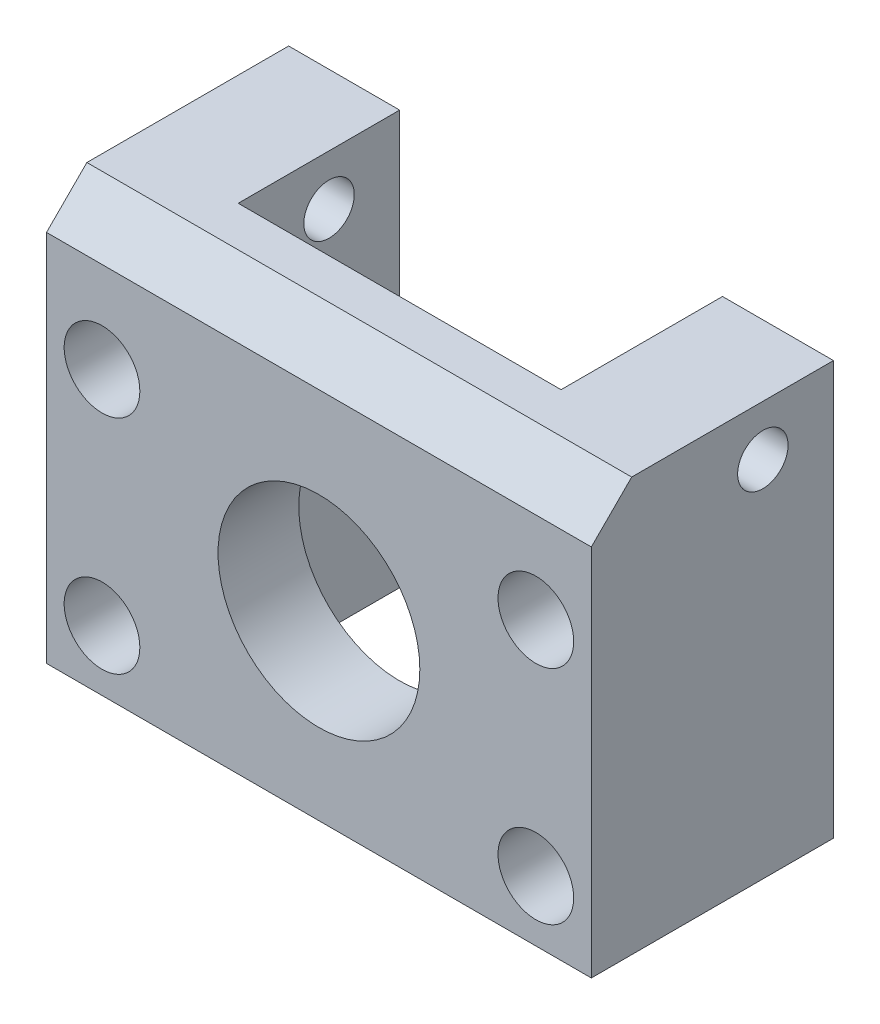
ISO-10303-21;
HEADER;
FILE_DESCRIPTION(('STEP AP214'),'2;1');
FILE_NAME('part.step','',(''),(''),'','','');
FILE_SCHEMA(('AUTOMOTIVE_DESIGN { 1 0 10303 214 1 1 1 1 }'));
ENDSEC;
DATA;
#1=APPLICATION_CONTEXT('core data for automotive mechanical design processes');
#2=APPLICATION_PROTOCOL_DEFINITION('international standard','automotive_design',2000,#1);
#3=PRODUCT_CONTEXT('',#1,'mechanical');
#4=PRODUCT('Part','Part','',(#3));
#5=PRODUCT_RELATED_PRODUCT_CATEGORY('part','',(#4));
#6=PRODUCT_DEFINITION_FORMATION('','',#4);
#7=PRODUCT_DEFINITION_CONTEXT('part definition',#1,'design');
#8=PRODUCT_DEFINITION('design','',#6,#7);
#9=PRODUCT_DEFINITION_SHAPE('','',#8);
#10=(LENGTH_UNIT() NAMED_UNIT(*) SI_UNIT(.MILLI.,.METRE.));
#11=(NAMED_UNIT(*) PLANE_ANGLE_UNIT() SI_UNIT($,.RADIAN.));
#12=(NAMED_UNIT(*) SI_UNIT($,.STERADIAN.) SOLID_ANGLE_UNIT());
#13=UNCERTAINTY_MEASURE_WITH_UNIT(LENGTH_MEASURE(1.E-05),#10,'distance_accuracy_value','');
#14=(GEOMETRIC_REPRESENTATION_CONTEXT(3) GLOBAL_UNCERTAINTY_ASSIGNED_CONTEXT((#13)) GLOBAL_UNIT_ASSIGNED_CONTEXT((#10,
#11,#12)) REPRESENTATION_CONTEXT('',''));
#15=CARTESIAN_POINT('',(0.,0.,0.));
#16=DIRECTION('',(0.,0.,1.));
#17=DIRECTION('',(1.,0.,0.));
#18=AXIS2_PLACEMENT_3D('',#15,#16,#17);
#19=CARTESIAN_POINT('',(0.,0.,-24.));
#20=DIRECTION('',(0.,0.,1.));
#21=DIRECTION('',(1.,0.,0.));
#22=AXIS2_PLACEMENT_3D('',#19,#20,#21);
#23=PLANE('',#22);
#24=CARTESIAN_POINT('',(-21.5,7.49999999999999,-24.));
#25=DIRECTION('',(0.,0.,1.));
#26=DIRECTION('',(1.,0.,0.));
#27=AXIS2_PLACEMENT_3D('',#24,#25,#26);
#28=CIRCLE('',#27,3.75);
#29=CARTESIAN_POINT('',(-17.75,7.49999999999999,-24.));
#30=VERTEX_POINT('',#29);
#31=EDGE_CURVE('E159',#30,#30,#28,.T.);
#32=ORIENTED_EDGE('',*,*,#31,.T.);
#33=EDGE_LOOP('',(#32));
#34=FACE_BOUND('',#33,.T.);
#35=CARTESIAN_POINT('',(-21.5,-14.5,-24.));
#36=DIRECTION('',(0.,0.,1.));
#37=DIRECTION('',(1.,0.,0.));
#38=AXIS2_PLACEMENT_3D('',#35,#36,#37);
#39=CIRCLE('',#38,3.75);
#40=CARTESIAN_POINT('',(-17.75,-14.5,-24.));
#41=VERTEX_POINT('',#40);
#42=EDGE_CURVE('E141',#41,#41,#39,.T.);
#43=ORIENTED_EDGE('',*,*,#42,.T.);
#44=EDGE_LOOP('',(#43));
#45=FACE_BOUND('',#44,.T.);
#46=DIRECTION('',(-1.,0.,0.));
#47=VECTOR('',#46,1.);
#48=CARTESIAN_POINT('',(-27.,20.5,-24.));
#49=LINE('',#48,#47);
#50=CARTESIAN_POINT('',(-16.,20.5,-24.));
#51=VERTEX_POINT('',#50);
#52=CARTESIAN_POINT('',(-27.,20.5,-24.));
#53=VERTEX_POINT('',#52);
#54=EDGE_CURVE('E168',#51,#53,#49,.T.);
#55=ORIENTED_EDGE('',*,*,#54,.F.);
#56=DIRECTION('',(0.,1.,0.));
#57=VECTOR('',#56,1.);
#58=CARTESIAN_POINT('',(-16.,20.5,-24.));
#59=LINE('',#58,#57);
#60=CARTESIAN_POINT('',(-16.,-20.5,-24.));
#61=VERTEX_POINT('',#60);
#62=EDGE_CURVE('E107',#61,#51,#59,.T.);
#63=ORIENTED_EDGE('',*,*,#62,.F.);
#64=DIRECTION('',(1.,0.,0.));
#65=VECTOR('',#64,1.);
#66=CARTESIAN_POINT('',(-27.,-20.5,-24.));
#67=LINE('',#66,#65);
#68=CARTESIAN_POINT('',(-27.,-20.5,-24.));
#69=VERTEX_POINT('',#68);
#70=EDGE_CURVE('E176',#69,#61,#67,.T.);
#71=ORIENTED_EDGE('',*,*,#70,.F.);
#72=DIRECTION('',(0.,-1.,0.));
#73=VECTOR('',#72,1.);
#74=CARTESIAN_POINT('',(-27.,20.5,-24.));
#75=LINE('',#74,#73);
#76=EDGE_CURVE('E172',#53,#69,#75,.T.);
#77=ORIENTED_EDGE('',*,*,#76,.F.);
#78=EDGE_LOOP('',(#55,#63,#71,#77));
#79=FACE_BOUND('',#78,.T.);
#80=ADVANCED_FACE('F32',(#34,#45,#79),#23,.F.);
#81=CARTESIAN_POINT('',(27.,20.5,-24.));
#82=DIRECTION('',(1.,0.,0.));
#83=DIRECTION('',(0.,1.,0.));
#84=AXIS2_PLACEMENT_3D('',#81,#82,#83);
#85=PLANE('',#84);
#86=CARTESIAN_POINT('',(27.,15.5,-17.));
#87=DIRECTION('',(1.,0.,0.));
#88=DIRECTION('',(0.,1.,0.));
#89=AXIS2_PLACEMENT_3D('',#86,#87,#88);
#90=CIRCLE('',#89,2.5);
#91=CARTESIAN_POINT('',(27.,18.,-17.));
#92=VERTEX_POINT('',#91);
#93=EDGE_CURVE('E397',#92,#92,#90,.T.);
#94=ORIENTED_EDGE('',*,*,#93,.F.);
#95=EDGE_LOOP('',(#94));
#96=FACE_BOUND('',#95,.T.);
#97=DIRECTION('',(0.,0.,1.));
#98=VECTOR('',#97,1.);
#99=CARTESIAN_POINT('',(27.,20.5,-24.));
#100=LINE('',#99,#98);
#101=CARTESIAN_POINT('',(27.,20.5,-24.));
#102=VERTEX_POINT('',#101);
#103=CARTESIAN_POINT('',(27.,20.5,-4.00000000000002));
#104=VERTEX_POINT('',#103);
#105=EDGE_CURVE('E179',#102,#104,#100,.T.);
#106=ORIENTED_EDGE('',*,*,#105,.T.);
#107=DIRECTION('',(0.,0.707106781186546,-0.707106781186549));
#108=VECTOR('',#107,1.);
#109=CARTESIAN_POINT('',(27.,30.5,-14.0000000000001));
#110=LINE('',#109,#108);
#111=CARTESIAN_POINT('',(27.,16.5,0.));
#112=VERTEX_POINT('',#111);
#113=EDGE_CURVE('E11',#104,#112,#110,.F.);
#114=ORIENTED_EDGE('',*,*,#113,.T.);
#115=DIRECTION('',(0.,1.,0.));
#116=VECTOR('',#115,1.);
#117=CARTESIAN_POINT('',(27.,20.5,0.));
#118=LINE('',#117,#116);
#119=CARTESIAN_POINT('',(27.,-20.5,0.));
#120=VERTEX_POINT('',#119);
#121=EDGE_CURVE('E162',#120,#112,#118,.T.);
#122=ORIENTED_EDGE('',*,*,#121,.F.);
#123=DIRECTION('',(0.,0.,1.));
#124=VECTOR('',#123,1.);
#125=CARTESIAN_POINT('',(27.,-20.5,-24.));
#126=LINE('',#125,#124);
#127=CARTESIAN_POINT('',(27.,-20.5,-24.));
#128=VERTEX_POINT('',#127);
#129=EDGE_CURVE('E186',#128,#120,#126,.T.);
#130=ORIENTED_EDGE('',*,*,#129,.F.);
#131=DIRECTION('',(0.,1.,0.));
#132=VECTOR('',#131,1.);
#133=CARTESIAN_POINT('',(27.,20.5,-24.));
#134=LINE('',#133,#132);
#135=EDGE_CURVE('E165',#128,#102,#134,.T.);
#136=ORIENTED_EDGE('',*,*,#135,.T.);
#137=EDGE_LOOP('',(#106,#114,#122,#130,#136));
#138=FACE_BOUND('',#137,.T.);
#139=ADVANCED_FACE('F217',(#96,#138),#85,.T.);
#140=CARTESIAN_POINT('',(-27.,-20.5,-24.));
#141=DIRECTION('',(0.,-1.,0.));
#142=DIRECTION('',(0.,0.,-1.));
#143=AXIS2_PLACEMENT_3D('',#140,#141,#142);
#144=PLANE('',#143);
#145=DIRECTION('',(0.,0.,-1.));
#146=VECTOR('',#145,1.);
#147=CARTESIAN_POINT('',(-16.,-20.5,-8.));
#148=LINE('',#147,#146);
#149=CARTESIAN_POINT('',(-16.,-20.5,-8.));
#150=VERTEX_POINT('',#149);
#151=EDGE_CURVE('E134',#150,#61,#148,.T.);
#152=ORIENTED_EDGE('',*,*,#151,.F.);
#153=DIRECTION('',(-1.,0.,0.));
#154=VECTOR('',#153,1.);
#155=CARTESIAN_POINT('',(16.,-20.5,-8.));
#156=LINE('',#155,#154);
#157=CARTESIAN_POINT('',(16.,-20.5,-8.));
#158=VERTEX_POINT('',#157);
#159=EDGE_CURVE('E111',#158,#150,#156,.T.);
#160=ORIENTED_EDGE('',*,*,#159,.F.);
#161=DIRECTION('',(0.,0.,-1.));
#162=VECTOR('',#161,1.);
#163=CARTESIAN_POINT('',(16.,-20.5,-8.));
#164=LINE('',#163,#162);
#165=CARTESIAN_POINT('',(16.,-20.5,-24.));
#166=VERTEX_POINT('',#165);
#167=EDGE_CURVE('E137',#158,#166,#164,.T.);
#168=ORIENTED_EDGE('',*,*,#167,.T.);
#169=EDGE_CURVE('E175',#166,#128,#67,.T.);
#170=ORIENTED_EDGE('',*,*,#169,.T.);
#171=ORIENTED_EDGE('',*,*,#129,.T.);
#172=DIRECTION('',(1.,0.,0.));
#173=VECTOR('',#172,1.);
#174=CARTESIAN_POINT('',(-27.,-20.5,0.));
#175=LINE('',#174,#173);
#176=CARTESIAN_POINT('',(-27.,-20.5,0.));
#177=VERTEX_POINT('',#176);
#178=EDGE_CURVE('E169',#177,#120,#175,.T.);
#179=ORIENTED_EDGE('',*,*,#178,.F.);
#180=DIRECTION('',(0.,0.,1.));
#181=VECTOR('',#180,1.);
#182=CARTESIAN_POINT('',(-27.,-20.5,-24.));
#183=LINE('',#182,#181);
#184=EDGE_CURVE('E189',#69,#177,#183,.T.);
#185=ORIENTED_EDGE('',*,*,#184,.F.);
#186=ORIENTED_EDGE('',*,*,#70,.T.);
#187=EDGE_LOOP('',(#152,#160,#168,#170,#171,#179,#185,#186));
#188=FACE_BOUND('',#187,.T.);
#189=ADVANCED_FACE('F212',(#188),#144,.T.);
#190=CARTESIAN_POINT('',(-27.,20.5,-24.));
#191=DIRECTION('',(-1.,0.,0.));
#192=DIRECTION('',(0.,-1.,0.));
#193=AXIS2_PLACEMENT_3D('',#190,#191,#192);
#194=PLANE('',#193);
#195=CARTESIAN_POINT('',(-27.,15.5,-17.));
#196=DIRECTION('',(1.,0.,0.));
#197=DIRECTION('',(0.,1.,0.));
#198=AXIS2_PLACEMENT_3D('',#195,#196,#197);
#199=CIRCLE('',#198,2.5);
#200=CARTESIAN_POINT('',(-27.,18.,-17.));
#201=VERTEX_POINT('',#200);
#202=EDGE_CURVE('E198',#201,#201,#199,.T.);
#203=ORIENTED_EDGE('',*,*,#202,.T.);
#204=EDGE_LOOP('',(#203));
#205=FACE_BOUND('',#204,.T.);
#206=DIRECTION('',(0.,-1.,0.));
#207=VECTOR('',#206,1.);
#208=CARTESIAN_POINT('',(-27.,20.5,0.));
#209=LINE('',#208,#207);
#210=CARTESIAN_POINT('',(-27.,16.5,0.));
#211=VERTEX_POINT('',#210);
#212=EDGE_CURVE('E182',#211,#177,#209,.T.);
#213=ORIENTED_EDGE('',*,*,#212,.F.);
#214=DIRECTION('',(0.,-0.707106781186546,0.707106781186549));
#215=VECTOR('',#214,1.);
#216=CARTESIAN_POINT('',(-27.,30.5,-14.0000000000001));
#217=LINE('',#216,#215);
#218=CARTESIAN_POINT('',(-27.,20.5,-4.00000000000002));
#219=VERTEX_POINT('',#218);
#220=EDGE_CURVE('E54',#211,#219,#217,.F.);
#221=ORIENTED_EDGE('',*,*,#220,.T.);
#222=DIRECTION('',(0.,0.,1.));
#223=VECTOR('',#222,1.);
#224=CARTESIAN_POINT('',(-27.,20.5,-24.));
#225=LINE('',#224,#223);
#226=EDGE_CURVE('E192',#53,#219,#225,.T.);
#227=ORIENTED_EDGE('',*,*,#226,.F.);
#228=ORIENTED_EDGE('',*,*,#76,.T.);
#229=ORIENTED_EDGE('',*,*,#184,.T.);
#230=EDGE_LOOP('',(#213,#221,#227,#228,#229));
#231=FACE_BOUND('',#230,.T.);
#232=ADVANCED_FACE('F207',(#205,#231),#194,.T.);
#233=CARTESIAN_POINT('',(-27.,20.5,-24.));
#234=DIRECTION('',(0.,1.,0.));
#235=DIRECTION('',(0.,0.,1.));
#236=AXIS2_PLACEMENT_3D('',#233,#234,#235);
#237=PLANE('',#236);
#238=ORIENTED_EDGE('',*,*,#226,.T.);
#239=DIRECTION('',(1.,0.,0.));
#240=VECTOR('',#239,1.);
#241=CARTESIAN_POINT('',(-27.,20.5,-4.00000000000002));
#242=LINE('',#241,#240);
#243=EDGE_CURVE('E40',#219,#104,#242,.T.);
#244=ORIENTED_EDGE('',*,*,#243,.T.);
#245=ORIENTED_EDGE('',*,*,#105,.F.);
#246=CARTESIAN_POINT('',(16.,20.5,-24.));
#247=VERTEX_POINT('',#246);
#248=EDGE_CURVE('E170',#102,#247,#49,.T.);
#249=ORIENTED_EDGE('',*,*,#248,.T.);
#250=DIRECTION('',(0.,0.,-1.));
#251=VECTOR('',#250,1.);
#252=CARTESIAN_POINT('',(16.,20.5,-8.));
#253=LINE('',#252,#251);
#254=CARTESIAN_POINT('',(16.,20.5,-8.));
#255=VERTEX_POINT('',#254);
#256=EDGE_CURVE('E110',#255,#247,#253,.T.);
#257=ORIENTED_EDGE('',*,*,#256,.F.);
#258=DIRECTION('',(1.,0.,0.));
#259=VECTOR('',#258,1.);
#260=CARTESIAN_POINT('',(16.,20.5,-8.));
#261=LINE('',#260,#259);
#262=CARTESIAN_POINT('',(-16.,20.5,-8.));
#263=VERTEX_POINT('',#262);
#264=EDGE_CURVE('E117',#263,#255,#261,.T.);
#265=ORIENTED_EDGE('',*,*,#264,.F.);
#266=DIRECTION('',(0.,0.,-1.));
#267=VECTOR('',#266,1.);
#268=CARTESIAN_POINT('',(-16.,20.5,-8.));
#269=LINE('',#268,#267);
#270=EDGE_CURVE('E101',#263,#51,#269,.T.);
#271=ORIENTED_EDGE('',*,*,#270,.T.);
#272=ORIENTED_EDGE('',*,*,#54,.T.);
#273=EDGE_LOOP('',(#238,#244,#245,#249,#257,#265,#271,#272));
#274=FACE_BOUND('',#273,.T.);
#275=ADVANCED_FACE('F123',(#274),#237,.T.);
#276=CARTESIAN_POINT('',(21.5,-14.5,-24.));
#277=DIRECTION('',(0.,0.,1.));
#278=DIRECTION('',(1.,0.,0.));
#279=AXIS2_PLACEMENT_3D('',#276,#277,#278);
#280=CIRCLE('',#279,3.75);
#281=CARTESIAN_POINT('',(25.25,-14.5,-24.));
#282=VERTEX_POINT('',#281);
#283=EDGE_CURVE('E147',#282,#282,#280,.T.);
#284=ORIENTED_EDGE('',*,*,#283,.T.);
#285=EDGE_LOOP('',(#284));
#286=FACE_BOUND('',#285,.T.);
#287=CARTESIAN_POINT('',(21.5,7.49999999999999,-24.));
#288=DIRECTION('',(0.,0.,1.));
#289=DIRECTION('',(1.,0.,0.));
#290=AXIS2_PLACEMENT_3D('',#287,#288,#289);
#291=CIRCLE('',#290,3.75);
#292=CARTESIAN_POINT('',(25.25,7.49999999999999,-24.));
#293=VERTEX_POINT('',#292);
#294=EDGE_CURVE('E153',#293,#293,#291,.T.);
#295=ORIENTED_EDGE('',*,*,#294,.T.);
#296=EDGE_LOOP('',(#295));
#297=FACE_BOUND('',#296,.T.);
#298=ORIENTED_EDGE('',*,*,#169,.F.);
#299=DIRECTION('',(0.,-1.,0.));
#300=VECTOR('',#299,1.);
#301=CARTESIAN_POINT('',(16.,20.5,-24.));
#302=LINE('',#301,#300);
#303=EDGE_CURVE('E121',#247,#166,#302,.T.);
#304=ORIENTED_EDGE('',*,*,#303,.F.);
#305=ORIENTED_EDGE('',*,*,#248,.F.);
#306=ORIENTED_EDGE('',*,*,#135,.F.);
#307=EDGE_LOOP('',(#298,#304,#305,#306));
#308=FACE_BOUND('',#307,.T.);
#309=ADVANCED_FACE('F233',(#286,#297,#308),#23,.F.);
#310=CARTESIAN_POINT('',(0.,0.,0.));
#311=DIRECTION('',(0.,0.,1.));
#312=DIRECTION('',(1.,0.,0.));
#313=AXIS2_PLACEMENT_3D('',#310,#311,#312);
#314=PLANE('',#313);
#315=CARTESIAN_POINT('',(0.,-2.5,0.));
#316=DIRECTION('',(0.,0.,1.));
#317=DIRECTION('',(1.,0.,0.));
#318=AXIS2_PLACEMENT_3D('',#315,#316,#317);
#319=CIRCLE('',#318,10.);
#320=CARTESIAN_POINT('',(10.,-2.5,0.));
#321=VERTEX_POINT('',#320);
#322=EDGE_CURVE('E400',#321,#321,#319,.T.);
#323=ORIENTED_EDGE('',*,*,#322,.F.);
#324=EDGE_LOOP('',(#323));
#325=FACE_BOUND('',#324,.T.);
#326=CARTESIAN_POINT('',(-21.5,-14.5,0.));
#327=DIRECTION('',(0.,0.,1.));
#328=DIRECTION('',(1.,0.,0.));
#329=AXIS2_PLACEMENT_3D('',#326,#327,#328);
#330=CIRCLE('',#329,3.75);
#331=CARTESIAN_POINT('',(-17.75,-14.5,0.));
#332=VERTEX_POINT('',#331);
#333=EDGE_CURVE('E136',#332,#332,#330,.T.);
#334=ORIENTED_EDGE('',*,*,#333,.F.);
#335=EDGE_LOOP('',(#334));
#336=FACE_BOUND('',#335,.T.);
#337=CARTESIAN_POINT('',(21.5,-14.5,0.));
#338=DIRECTION('',(0.,0.,1.));
#339=DIRECTION('',(1.,0.,0.));
#340=AXIS2_PLACEMENT_3D('',#337,#338,#339);
#341=CIRCLE('',#340,3.75);
#342=CARTESIAN_POINT('',(25.25,-14.5,0.));
#343=VERTEX_POINT('',#342);
#344=EDGE_CURVE('E144',#343,#343,#341,.T.);
#345=ORIENTED_EDGE('',*,*,#344,.F.);
#346=EDGE_LOOP('',(#345));
#347=FACE_BOUND('',#346,.T.);
#348=CARTESIAN_POINT('',(21.5,7.49999999999999,0.));
#349=DIRECTION('',(0.,0.,1.));
#350=DIRECTION('',(1.,0.,0.));
#351=AXIS2_PLACEMENT_3D('',#348,#349,#350);
#352=CIRCLE('',#351,3.75);
#353=CARTESIAN_POINT('',(25.25,7.49999999999999,0.));
#354=VERTEX_POINT('',#353);
#355=EDGE_CURVE('E150',#354,#354,#352,.T.);
#356=ORIENTED_EDGE('',*,*,#355,.F.);
#357=EDGE_LOOP('',(#356));
#358=FACE_BOUND('',#357,.T.);
#359=CARTESIAN_POINT('',(-21.5,7.49999999999999,0.));
#360=DIRECTION('',(0.,0.,1.));
#361=DIRECTION('',(1.,0.,0.));
#362=AXIS2_PLACEMENT_3D('',#359,#360,#361);
#363=CIRCLE('',#362,3.75);
#364=CARTESIAN_POINT('',(-17.75,7.49999999999999,0.));
#365=VERTEX_POINT('',#364);
#366=EDGE_CURVE('E156',#365,#365,#363,.T.);
#367=ORIENTED_EDGE('',*,*,#366,.F.);
#368=EDGE_LOOP('',(#367));
#369=FACE_BOUND('',#368,.T.);
#370=ORIENTED_EDGE('',*,*,#121,.T.);
#371=DIRECTION('',(-1.,0.,0.));
#372=VECTOR('',#371,1.);
#373=CARTESIAN_POINT('',(0.,16.5,0.));
#374=LINE('',#373,#372);
#375=EDGE_CURVE('E188',#112,#211,#374,.T.);
#376=ORIENTED_EDGE('',*,*,#375,.T.);
#377=ORIENTED_EDGE('',*,*,#212,.T.);
#378=ORIENTED_EDGE('',*,*,#178,.T.);
#379=EDGE_LOOP('',(#370,#376,#377,#378));
#380=FACE_BOUND('',#379,.T.);
#381=ADVANCED_FACE('F203',(#325,#336,#347,#358,#369,#380),#314,.T.);
#382=CARTESIAN_POINT('',(-21.5,7.49999999999999,-24.));
#383=DIRECTION('',(0.,0.,1.));
#384=DIRECTION('',(1.,0.,0.));
#385=AXIS2_PLACEMENT_3D('',#382,#383,#384);
#386=CYLINDRICAL_SURFACE('',#385,3.75);
#387=ORIENTED_EDGE('',*,*,#31,.F.);
#388=EDGE_LOOP('',(#387));
#389=FACE_BOUND('',#388,.T.);
#390=ORIENTED_EDGE('',*,*,#366,.T.);
#391=EDGE_LOOP('',(#390));
#392=FACE_BOUND('',#391,.T.);
#393=ADVANCED_FACE('F247',(#389,#392),#386,.F.);
#394=CARTESIAN_POINT('',(21.5,7.49999999999999,-24.));
#395=DIRECTION('',(0.,0.,1.));
#396=DIRECTION('',(1.,0.,0.));
#397=AXIS2_PLACEMENT_3D('',#394,#395,#396);
#398=CYLINDRICAL_SURFACE('',#397,3.75);
#399=ORIENTED_EDGE('',*,*,#294,.F.);
#400=EDGE_LOOP('',(#399));
#401=FACE_BOUND('',#400,.T.);
#402=ORIENTED_EDGE('',*,*,#355,.T.);
#403=EDGE_LOOP('',(#402));
#404=FACE_BOUND('',#403,.T.);
#405=ADVANCED_FACE('F278',(#401,#404),#398,.F.);
#406=CARTESIAN_POINT('',(21.5,-14.5,-24.));
#407=DIRECTION('',(0.,0.,1.));
#408=DIRECTION('',(1.,0.,0.));
#409=AXIS2_PLACEMENT_3D('',#406,#407,#408);
#410=CYLINDRICAL_SURFACE('',#409,3.75);
#411=ORIENTED_EDGE('',*,*,#283,.F.);
#412=EDGE_LOOP('',(#411));
#413=FACE_BOUND('',#412,.T.);
#414=ORIENTED_EDGE('',*,*,#344,.T.);
#415=EDGE_LOOP('',(#414));
#416=FACE_BOUND('',#415,.T.);
#417=ADVANCED_FACE('F274',(#413,#416),#410,.F.);
#418=CARTESIAN_POINT('',(-21.5,-14.5,-24.));
#419=DIRECTION('',(0.,0.,1.));
#420=DIRECTION('',(1.,0.,0.));
#421=AXIS2_PLACEMENT_3D('',#418,#419,#420);
#422=CYLINDRICAL_SURFACE('',#421,3.75);
#423=ORIENTED_EDGE('',*,*,#42,.F.);
#424=EDGE_LOOP('',(#423));
#425=FACE_BOUND('',#424,.T.);
#426=ORIENTED_EDGE('',*,*,#333,.T.);
#427=EDGE_LOOP('',(#426));
#428=FACE_BOUND('',#427,.T.);
#429=ADVANCED_FACE('F268',(#425,#428),#422,.F.);
#430=CARTESIAN_POINT('',(-16.,20.5,-8.));
#431=DIRECTION('',(-1.,0.,0.));
#432=DIRECTION('',(0.,0.,1.));
#433=AXIS2_PLACEMENT_3D('',#430,#431,#432);
#434=PLANE('',#433);
#435=CARTESIAN_POINT('',(-16.,15.5,-17.));
#436=DIRECTION('',(-1.,0.,0.));
#437=DIRECTION('',(0.,0.,1.));
#438=AXIS2_PLACEMENT_3D('',#435,#436,#437);
#439=CIRCLE('',#438,2.5);
#440=CARTESIAN_POINT('',(-16.,15.5,-14.5));
#441=VERTEX_POINT('',#440);
#442=EDGE_CURVE('E132',#441,#441,#439,.T.);
#443=ORIENTED_EDGE('',*,*,#442,.T.);
#444=EDGE_LOOP('',(#443));
#445=FACE_BOUND('',#444,.T.);
#446=ORIENTED_EDGE('',*,*,#62,.T.);
#447=ORIENTED_EDGE('',*,*,#270,.F.);
#448=DIRECTION('',(0.,1.,0.));
#449=VECTOR('',#448,1.);
#450=CARTESIAN_POINT('',(-16.,20.5,-8.));
#451=LINE('',#450,#449);
#452=EDGE_CURVE('E104',#150,#263,#451,.T.);
#453=ORIENTED_EDGE('',*,*,#452,.F.);
#454=ORIENTED_EDGE('',*,*,#151,.T.);
#455=EDGE_LOOP('',(#446,#447,#453,#454));
#456=FACE_BOUND('',#455,.T.);
#457=ADVANCED_FACE('F103',(#445,#456),#434,.F.);
#458=CARTESIAN_POINT('',(16.,20.5,-8.));
#459=DIRECTION('',(1.,0.,0.));
#460=DIRECTION('',(0.,0.,-1.));
#461=AXIS2_PLACEMENT_3D('',#458,#459,#460);
#462=PLANE('',#461);
#463=CARTESIAN_POINT('',(16.,15.5,-17.));
#464=DIRECTION('',(1.,0.,0.));
#465=DIRECTION('',(0.,0.,-1.));
#466=AXIS2_PLACEMENT_3D('',#463,#464,#465);
#467=CIRCLE('',#466,2.5);
#468=CARTESIAN_POINT('',(16.,15.5,-19.5));
#469=VERTEX_POINT('',#468);
#470=EDGE_CURVE('E195',#469,#469,#467,.T.);
#471=ORIENTED_EDGE('',*,*,#470,.T.);
#472=EDGE_LOOP('',(#471));
#473=FACE_BOUND('',#472,.T.);
#474=ORIENTED_EDGE('',*,*,#303,.T.);
#475=ORIENTED_EDGE('',*,*,#167,.F.);
#476=DIRECTION('',(0.,-1.,0.));
#477=VECTOR('',#476,1.);
#478=CARTESIAN_POINT('',(16.,20.5,-8.));
#479=LINE('',#478,#477);
#480=EDGE_CURVE('E125',#255,#158,#479,.T.);
#481=ORIENTED_EDGE('',*,*,#480,.F.);
#482=ORIENTED_EDGE('',*,*,#256,.T.);
#483=EDGE_LOOP('',(#474,#475,#481,#482));
#484=FACE_BOUND('',#483,.T.);
#485=ADVANCED_FACE('F257',(#473,#484),#462,.F.);
#486=CARTESIAN_POINT('',(0.,0.,-8.));
#487=DIRECTION('',(0.,0.,-1.));
#488=DIRECTION('',(-1.,0.,0.));
#489=AXIS2_PLACEMENT_3D('',#486,#487,#488);
#490=PLANE('',#489);
#491=CARTESIAN_POINT('',(0.,-2.5,-8.));
#492=DIRECTION('',(0.,0.,-1.));
#493=DIRECTION('',(-1.,0.,0.));
#494=AXIS2_PLACEMENT_3D('',#491,#492,#493);
#495=CIRCLE('',#494,10.);
#496=CARTESIAN_POINT('',(10.,-2.5,-8.));
#497=VERTEX_POINT('',#496);
#498=EDGE_CURVE('E403',#497,#497,#495,.F.);
#499=ORIENTED_EDGE('',*,*,#498,.T.);
#500=EDGE_LOOP('',(#499));
#501=FACE_BOUND('',#500,.T.);
#502=ORIENTED_EDGE('',*,*,#452,.T.);
#503=ORIENTED_EDGE('',*,*,#264,.T.);
#504=ORIENTED_EDGE('',*,*,#480,.T.);
#505=ORIENTED_EDGE('',*,*,#159,.T.);
#506=EDGE_LOOP('',(#502,#503,#504,#505));
#507=FACE_BOUND('',#506,.T.);
#508=ADVANCED_FACE('F115',(#501,#507),#490,.T.);
#509=CARTESIAN_POINT('',(-27.,15.5,-17.));
#510=DIRECTION('',(1.,0.,0.));
#511=DIRECTION('',(0.,1.,0.));
#512=AXIS2_PLACEMENT_3D('',#509,#510,#511);
#513=CYLINDRICAL_SURFACE('',#512,2.5);
#514=ORIENTED_EDGE('',*,*,#93,.T.);
#515=EDGE_LOOP('',(#514));
#516=FACE_BOUND('',#515,.T.);
#517=ORIENTED_EDGE('',*,*,#470,.F.);
#518=EDGE_LOOP('',(#517));
#519=FACE_BOUND('',#518,.T.);
#520=ADVANCED_FACE('F227',(#516,#519),#513,.F.);
#521=ORIENTED_EDGE('',*,*,#202,.F.);
#522=EDGE_LOOP('',(#521));
#523=FACE_BOUND('',#522,.T.);
#524=ORIENTED_EDGE('',*,*,#442,.F.);
#525=EDGE_LOOP('',(#524));
#526=FACE_BOUND('',#525,.T.);
#527=ADVANCED_FACE('F220',(#523,#526),#513,.F.);
#528=CARTESIAN_POINT('',(0.,16.5,0.));
#529=DIRECTION('',(0.,-0.707106781186549,-0.707106781186546));
#530=DIRECTION('',(-1.,0.,0.));
#531=AXIS2_PLACEMENT_3D('',#528,#529,#530);
#532=PLANE('',#531);
#533=ORIENTED_EDGE('',*,*,#113,.F.);
#534=ORIENTED_EDGE('',*,*,#243,.F.);
#535=ORIENTED_EDGE('',*,*,#220,.F.);
#536=ORIENTED_EDGE('',*,*,#375,.F.);
#537=EDGE_LOOP('',(#533,#534,#535,#536));
#538=FACE_BOUND('',#537,.T.);
#539=ADVANCED_FACE('F34',(#538),#532,.F.);
#540=CARTESIAN_POINT('',(0.,-2.5,-24.001));
#541=DIRECTION('',(0.,0.,1.));
#542=DIRECTION('',(1.,0.,0.));
#543=AXIS2_PLACEMENT_3D('',#540,#541,#542);
#544=CYLINDRICAL_SURFACE('',#543,10.);
#545=CARTESIAN_POINT('',(10.,-2.5,-8.));
#546=CARTESIAN_POINT('',(10.,-2.5,-7.91666666666666));
#547=CARTESIAN_POINT('',(10.,-2.5,-7.83333333333333));
#548=CARTESIAN_POINT('',(10.,-2.5,-7.66666666666666));
#549=CARTESIAN_POINT('',(10.,-2.5,-7.58333333333333));
#550=CARTESIAN_POINT('',(10.,-2.5,-7.41666666666666));
#551=CARTESIAN_POINT('',(10.,-2.5,-7.33333333333333));
#552=CARTESIAN_POINT('',(10.,-2.5,-7.16666666666666));
#553=CARTESIAN_POINT('',(10.,-2.5,-7.08333333333333));
#554=CARTESIAN_POINT('',(10.,-2.5,-6.91666666666666));
#555=CARTESIAN_POINT('',(10.,-2.5,-6.83333333333333));
#556=CARTESIAN_POINT('',(10.,-2.5,-6.66666666666667));
#557=CARTESIAN_POINT('',(10.,-2.5,-6.58333333333333));
#558=CARTESIAN_POINT('',(10.,-2.5,-6.41666666666667));
#559=CARTESIAN_POINT('',(10.,-2.5,-6.33333333333333));
#560=CARTESIAN_POINT('',(10.,-2.5,-6.16666666666667));
#561=CARTESIAN_POINT('',(10.,-2.5,-6.08333333333333));
#562=CARTESIAN_POINT('',(10.,-2.5,-5.91666666666666));
#563=CARTESIAN_POINT('',(10.,-2.5,-5.83333333333333));
#564=CARTESIAN_POINT('',(10.,-2.5,-5.66666666666666));
#565=CARTESIAN_POINT('',(10.,-2.5,-5.58333333333333));
#566=CARTESIAN_POINT('',(10.,-2.5,-5.41666666666666));
#567=CARTESIAN_POINT('',(10.,-2.5,-5.33333333333333));
#568=CARTESIAN_POINT('',(10.,-2.5,-5.16666666666667));
#569=CARTESIAN_POINT('',(10.,-2.5,-5.08333333333333));
#570=CARTESIAN_POINT('',(10.,-2.5,-4.91666666666667));
#571=CARTESIAN_POINT('',(10.,-2.5,-4.83333333333333));
#572=CARTESIAN_POINT('',(10.,-2.5,-4.66666666666667));
#573=CARTESIAN_POINT('',(10.,-2.5,-4.58333333333333));
#574=CARTESIAN_POINT('',(10.,-2.5,-4.41666666666667));
#575=CARTESIAN_POINT('',(10.,-2.5,-4.33333333333333));
#576=CARTESIAN_POINT('',(10.,-2.5,-4.16666666666667));
#577=CARTESIAN_POINT('',(10.,-2.5,-4.08333333333333));
#578=CARTESIAN_POINT('',(10.,-2.5,-3.91666666666667));
#579=CARTESIAN_POINT('',(10.,-2.5,-3.83333333333333));
#580=CARTESIAN_POINT('',(10.,-2.5,-3.66666666666667));
#581=CARTESIAN_POINT('',(10.,-2.5,-3.58333333333333));
#582=CARTESIAN_POINT('',(10.,-2.5,-3.41666666666667));
#583=CARTESIAN_POINT('',(10.,-2.5,-3.33333333333333));
#584=CARTESIAN_POINT('',(10.,-2.5,-3.16666666666667));
#585=CARTESIAN_POINT('',(10.,-2.5,-3.08333333333333));
#586=CARTESIAN_POINT('',(10.,-2.5,-2.91666666666667));
#587=CARTESIAN_POINT('',(10.,-2.5,-2.83333333333333));
#588=CARTESIAN_POINT('',(10.,-2.5,-2.66666666666667));
#589=CARTESIAN_POINT('',(10.,-2.5,-2.58333333333333));
#590=CARTESIAN_POINT('',(10.,-2.5,-2.41666666666667));
#591=CARTESIAN_POINT('',(10.,-2.5,-2.33333333333334));
#592=CARTESIAN_POINT('',(10.,-2.5,-2.16666666666667));
#593=CARTESIAN_POINT('',(10.,-2.5,-2.08333333333334));
#594=CARTESIAN_POINT('',(10.,-2.5,-1.91666666666667));
#595=CARTESIAN_POINT('',(10.,-2.5,-1.83333333333334));
#596=CARTESIAN_POINT('',(10.,-2.5,-1.66666666666667));
#597=CARTESIAN_POINT('',(10.,-2.5,-1.58333333333333));
#598=CARTESIAN_POINT('',(10.,-2.5,-1.41666666666667));
#599=CARTESIAN_POINT('',(10.,-2.5,-1.33333333333334));
#600=CARTESIAN_POINT('',(10.,-2.5,-1.16666666666667));
#601=CARTESIAN_POINT('',(10.,-2.5,-1.08333333333334));
#602=CARTESIAN_POINT('',(10.,-2.5,-0.916666666666671));
#603=CARTESIAN_POINT('',(10.,-2.5,-0.833333333333337));
#604=CARTESIAN_POINT('',(10.,-2.5,-0.666666666666671));
#605=CARTESIAN_POINT('',(10.,-2.5,-0.583333333333337));
#606=CARTESIAN_POINT('',(10.,-2.5,-0.416666666666671));
#607=CARTESIAN_POINT('',(10.,-2.5,-0.333333333333337));
#608=CARTESIAN_POINT('',(10.,-2.5,-0.16666666666667));
#609=CARTESIAN_POINT('',(10.,-2.5,-0.0833333333333368));
#610=CARTESIAN_POINT('',(10.,-2.5,0.));
#611=B_SPLINE_CURVE_WITH_KNOTS('',3,(#545,#546,#547,#548,#549,#550,#551,#552,#553,#554,#555,
#556,#557,#558,#559,#560,#561,#562,#563,#564,#565,#566,#567,#568,#569,#570,#571,#572,#573,#574,
#575,#576,#577,#578,#579,#580,#581,#582,#583,#584,#585,#586,#587,#588,#589,#590,#591,#592,#593,
#594,#595,#596,#597,#598,#599,#600,#601,#602,#603,#604,#605,#606,#607,#608,#609,#610),
.UNSPECIFIED.,.F.,.F.,(4,2,2,2,2,2,2,2,2,2,2,2,2,2,2,2,2,2,2,2,2,2,2,2,2,2,2,2,2,2,2,2,4),(0.,
0.25,0.5,0.750000000000001,1.,1.25,1.5,1.75,2.,2.25,2.5,2.75,3.,3.25,3.5,3.75,4.,4.25,4.5,4.75,
5.,5.25,5.49999999999999,5.74999999999999,5.99999999999999,6.25,6.5,6.74999999999999,
6.99999999999999,7.24999999999999,7.49999999999999,7.74999999999999,7.99999999999999),.UNSPECIFIED.);
#612=EDGE_CURVE('BSEAM219',#497,#321,#611,.T.);
#613=ORIENTED_EDGE('',*,*,#498,.F.);
#614=ORIENTED_EDGE('',*,*,#322,.T.);
#615=ORIENTED_EDGE('',*,*,#612,.T.);
#616=ORIENTED_EDGE('',*,*,#612,.F.);
#617=EDGE_LOOP('',(#613,#615,#614,#616));
#618=FACE_BOUND('',#617,.T.);
#619=ADVANCED_FACE('F219',(#618),#544,.F.);
#620=CLOSED_SHELL('',(#80,#139,#189,#232,#275,#309,#381,#393,#405,#417,#429,#457,#485,#508,#520,
#527,#539,#619));
#621=MANIFOLD_SOLID_BREP('B2',#620);
#622=ADVANCED_BREP_SHAPE_REPRESENTATION('',(#18,#621),#14);
#623=SHAPE_DEFINITION_REPRESENTATION(#9,#622);
ENDSEC;
END-ISO-10303-21;
